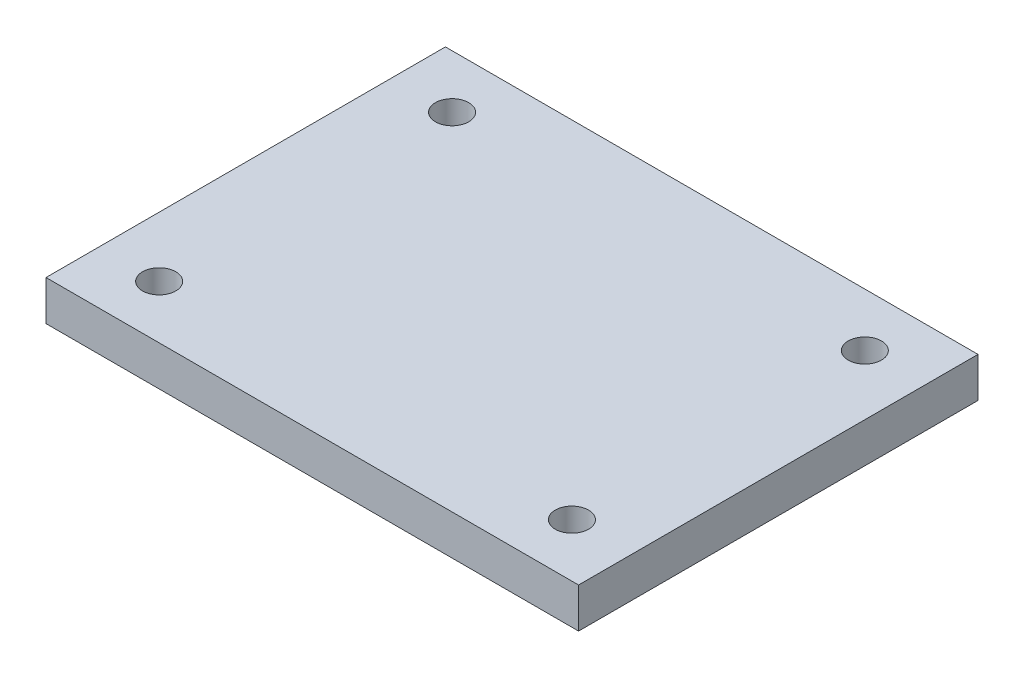
ISO-10303-21;
HEADER;
FILE_DESCRIPTION(('STEP AP214'),'2;1');
FILE_NAME('part.step','',(''),(''),'','','');
FILE_SCHEMA(('AUTOMOTIVE_DESIGN { 1 0 10303 214 1 1 1 1 }'));
ENDSEC;
DATA;
#1=APPLICATION_CONTEXT('core data for automotive mechanical design processes');
#2=APPLICATION_PROTOCOL_DEFINITION('international standard','automotive_design',2000,#1);
#3=PRODUCT_CONTEXT('',#1,'mechanical');
#4=PRODUCT('Part','Part','',(#3));
#5=PRODUCT_RELATED_PRODUCT_CATEGORY('part','',(#4));
#6=PRODUCT_DEFINITION_FORMATION('','',#4);
#7=PRODUCT_DEFINITION_CONTEXT('part definition',#1,'design');
#8=PRODUCT_DEFINITION('design','',#6,#7);
#9=PRODUCT_DEFINITION_SHAPE('','',#8);
#10=(LENGTH_UNIT() NAMED_UNIT(*) SI_UNIT(.MILLI.,.METRE.));
#11=(NAMED_UNIT(*) PLANE_ANGLE_UNIT() SI_UNIT($,.RADIAN.));
#12=(NAMED_UNIT(*) SI_UNIT($,.STERADIAN.) SOLID_ANGLE_UNIT());
#13=UNCERTAINTY_MEASURE_WITH_UNIT(LENGTH_MEASURE(1.E-05),#10,'distance_accuracy_value','');
#14=(GEOMETRIC_REPRESENTATION_CONTEXT(3) GLOBAL_UNCERTAINTY_ASSIGNED_CONTEXT((#13)) GLOBAL_UNIT_ASSIGNED_CONTEXT((#10,
#11,#12)) REPRESENTATION_CONTEXT('',''));
#15=CARTESIAN_POINT('',(0.,0.,0.));
#16=DIRECTION('',(0.,0.,1.));
#17=DIRECTION('',(1.,0.,0.));
#18=AXIS2_PLACEMENT_3D('',#15,#16,#17);
#19=CARTESIAN_POINT('',(20.,3.,-15.));
#20=DIRECTION('',(-1.,0.,0.));
#21=DIRECTION('',(0.,0.,1.));
#22=AXIS2_PLACEMENT_3D('',#19,#20,#21);
#23=PLANE('',#22);
#24=DIRECTION('',(0.,0.,-1.));
#25=VECTOR('',#24,1.);
#26=CARTESIAN_POINT('',(20.,0.,-15.));
#27=LINE('',#26,#25);
#28=CARTESIAN_POINT('',(20.,0.,15.));
#29=VERTEX_POINT('',#28);
#30=CARTESIAN_POINT('',(20.,0.,-15.));
#31=VERTEX_POINT('',#30);
#32=EDGE_CURVE('E110',#29,#31,#27,.T.);
#33=ORIENTED_EDGE('',*,*,#32,.T.);
#34=DIRECTION('',(0.,-1.,0.));
#35=VECTOR('',#34,1.);
#36=CARTESIAN_POINT('',(20.,3.,-15.));
#37=LINE('',#36,#35);
#38=CARTESIAN_POINT('',(20.,3.,-15.));
#39=VERTEX_POINT('',#38);
#40=EDGE_CURVE('E11',#39,#31,#37,.T.);
#41=ORIENTED_EDGE('',*,*,#40,.F.);
#42=DIRECTION('',(0.,0.,-1.));
#43=VECTOR('',#42,1.);
#44=CARTESIAN_POINT('',(20.,3.,-15.));
#45=LINE('',#44,#43);
#46=CARTESIAN_POINT('',(20.,3.,15.));
#47=VERTEX_POINT('',#46);
#48=EDGE_CURVE('E94',#47,#39,#45,.T.);
#49=ORIENTED_EDGE('',*,*,#48,.F.);
#50=DIRECTION('',(0.,-1.,0.));
#51=VECTOR('',#50,1.);
#52=CARTESIAN_POINT('',(20.,3.,15.));
#53=LINE('',#52,#51);
#54=EDGE_CURVE('E103',#47,#29,#53,.T.);
#55=ORIENTED_EDGE('',*,*,#54,.T.);
#56=EDGE_LOOP('',(#33,#41,#49,#55));
#57=FACE_BOUND('',#56,.T.);
#58=ADVANCED_FACE('F41',(#57),#23,.F.);
#59=CARTESIAN_POINT('',(-20.,3.,-15.));
#60=DIRECTION('',(0.,0.,1.));
#61=DIRECTION('',(1.,0.,0.));
#62=AXIS2_PLACEMENT_3D('',#59,#60,#61);
#63=PLANE('',#62);
#64=DIRECTION('',(-1.,0.,0.));
#65=VECTOR('',#64,1.);
#66=CARTESIAN_POINT('',(-20.,0.,-15.));
#67=LINE('',#66,#65);
#68=CARTESIAN_POINT('',(-20.,0.,-15.));
#69=VERTEX_POINT('',#68);
#70=EDGE_CURVE('E98',#31,#69,#67,.T.);
#71=ORIENTED_EDGE('',*,*,#70,.T.);
#72=DIRECTION('',(0.,-1.,0.));
#73=VECTOR('',#72,1.);
#74=CARTESIAN_POINT('',(-20.,3.,-15.));
#75=LINE('',#74,#73);
#76=CARTESIAN_POINT('',(-20.,3.,-15.));
#77=VERTEX_POINT('',#76);
#78=EDGE_CURVE('E49',#77,#69,#75,.T.);
#79=ORIENTED_EDGE('',*,*,#78,.F.);
#80=DIRECTION('',(-1.,0.,0.));
#81=VECTOR('',#80,1.);
#82=CARTESIAN_POINT('',(-20.,3.,-15.));
#83=LINE('',#82,#81);
#84=EDGE_CURVE('E90',#39,#77,#83,.T.);
#85=ORIENTED_EDGE('',*,*,#84,.F.);
#86=ORIENTED_EDGE('',*,*,#40,.T.);
#87=EDGE_LOOP('',(#71,#79,#85,#86));
#88=FACE_BOUND('',#87,.T.);
#89=ADVANCED_FACE('F100',(#88),#63,.F.);
#90=CARTESIAN_POINT('',(-20.,3.,-15.));
#91=DIRECTION('',(1.,0.,0.));
#92=DIRECTION('',(0.,0.,-1.));
#93=AXIS2_PLACEMENT_3D('',#90,#91,#92);
#94=PLANE('',#93);
#95=DIRECTION('',(0.,0.,1.));
#96=VECTOR('',#95,1.);
#97=CARTESIAN_POINT('',(-20.,0.,-15.));
#98=LINE('',#97,#96);
#99=CARTESIAN_POINT('',(-20.,0.,15.));
#100=VERTEX_POINT('',#99);
#101=EDGE_CURVE('E76',#69,#100,#98,.T.);
#102=ORIENTED_EDGE('',*,*,#101,.T.);
#103=DIRECTION('',(0.,-1.,0.));
#104=VECTOR('',#103,1.);
#105=CARTESIAN_POINT('',(-20.,3.,15.));
#106=LINE('',#105,#104);
#107=CARTESIAN_POINT('',(-20.,3.,15.));
#108=VERTEX_POINT('',#107);
#109=EDGE_CURVE('E97',#108,#100,#106,.T.);
#110=ORIENTED_EDGE('',*,*,#109,.F.);
#111=DIRECTION('',(0.,0.,1.));
#112=VECTOR('',#111,1.);
#113=CARTESIAN_POINT('',(-20.,3.,-15.));
#114=LINE('',#113,#112);
#115=EDGE_CURVE('E95',#77,#108,#114,.T.);
#116=ORIENTED_EDGE('',*,*,#115,.F.);
#117=ORIENTED_EDGE('',*,*,#78,.T.);
#118=EDGE_LOOP('',(#102,#110,#116,#117));
#119=FACE_BOUND('',#118,.T.);
#120=ADVANCED_FACE('F101',(#119),#94,.F.);
#121=CARTESIAN_POINT('',(-20.,3.,15.));
#122=DIRECTION('',(0.,0.,-1.));
#123=DIRECTION('',(-1.,0.,0.));
#124=AXIS2_PLACEMENT_3D('',#121,#122,#123);
#125=PLANE('',#124);
#126=DIRECTION('',(1.,0.,0.));
#127=VECTOR('',#126,1.);
#128=CARTESIAN_POINT('',(-20.,0.,15.));
#129=LINE('',#128,#127);
#130=EDGE_CURVE('E85',#100,#29,#129,.T.);
#131=ORIENTED_EDGE('',*,*,#130,.T.);
#132=ORIENTED_EDGE('',*,*,#54,.F.);
#133=DIRECTION('',(1.,0.,0.));
#134=VECTOR('',#133,1.);
#135=CARTESIAN_POINT('',(-20.,3.,15.));
#136=LINE('',#135,#134);
#137=EDGE_CURVE('E56',#108,#47,#136,.T.);
#138=ORIENTED_EDGE('',*,*,#137,.F.);
#139=ORIENTED_EDGE('',*,*,#109,.T.);
#140=EDGE_LOOP('',(#131,#132,#138,#139));
#141=FACE_BOUND('',#140,.T.);
#142=ADVANCED_FACE('F158',(#141),#125,.F.);
#143=CARTESIAN_POINT('',(0.,3.,0.));
#144=DIRECTION('',(0.,1.,0.));
#145=DIRECTION('',(0.,0.,1.));
#146=AXIS2_PLACEMENT_3D('',#143,#144,#145);
#147=PLANE('',#146);
#148=CARTESIAN_POINT('',(15.5,3.,11.));
#149=DIRECTION('',(0.,1.,0.));
#150=DIRECTION('',(0.,0.,1.));
#151=AXIS2_PLACEMENT_3D('',#148,#149,#150);
#152=CIRCLE('',#151,1.25);
#153=CARTESIAN_POINT('',(15.5,3.,12.25));
#154=VERTEX_POINT('',#153);
#155=EDGE_CURVE('E227',#154,#154,#152,.T.);
#156=ORIENTED_EDGE('',*,*,#155,.F.);
#157=EDGE_LOOP('',(#156));
#158=FACE_BOUND('',#157,.T.);
#159=CARTESIAN_POINT('',(-15.5,3.,11.));
#160=DIRECTION('',(0.,1.,0.));
#161=DIRECTION('',(0.,0.,1.));
#162=AXIS2_PLACEMENT_3D('',#159,#160,#161);
#163=CIRCLE('',#162,1.25);
#164=CARTESIAN_POINT('',(-15.5,3.,12.25));
#165=VERTEX_POINT('',#164);
#166=EDGE_CURVE('E225',#165,#165,#163,.T.);
#167=ORIENTED_EDGE('',*,*,#166,.F.);
#168=EDGE_LOOP('',(#167));
#169=FACE_BOUND('',#168,.T.);
#170=CARTESIAN_POINT('',(-15.5,3.,-11.));
#171=DIRECTION('',(0.,1.,0.));
#172=DIRECTION('',(0.,0.,1.));
#173=AXIS2_PLACEMENT_3D('',#170,#171,#172);
#174=CIRCLE('',#173,1.25);
#175=CARTESIAN_POINT('',(-15.5,3.,-9.75));
#176=VERTEX_POINT('',#175);
#177=EDGE_CURVE('E214',#176,#176,#174,.T.);
#178=ORIENTED_EDGE('',*,*,#177,.F.);
#179=EDGE_LOOP('',(#178));
#180=FACE_BOUND('',#179,.T.);
#181=CARTESIAN_POINT('',(15.5,3.,-11.));
#182=DIRECTION('',(0.,1.,0.));
#183=DIRECTION('',(0.,0.,1.));
#184=AXIS2_PLACEMENT_3D('',#181,#182,#183);
#185=CIRCLE('',#184,1.25);
#186=CARTESIAN_POINT('',(15.5,3.,-9.75));
#187=VERTEX_POINT('',#186);
#188=EDGE_CURVE('E118',#187,#187,#185,.T.);
#189=ORIENTED_EDGE('',*,*,#188,.F.);
#190=EDGE_LOOP('',(#189));
#191=FACE_BOUND('',#190,.T.);
#192=ORIENTED_EDGE('',*,*,#48,.T.);
#193=ORIENTED_EDGE('',*,*,#84,.T.);
#194=ORIENTED_EDGE('',*,*,#115,.T.);
#195=ORIENTED_EDGE('',*,*,#137,.T.);
#196=EDGE_LOOP('',(#192,#193,#194,#195));
#197=FACE_BOUND('',#196,.T.);
#198=ADVANCED_FACE('F89',(#158,#169,#180,#191,#197),#147,.T.);
#199=CARTESIAN_POINT('',(0.,0.,0.));
#200=DIRECTION('',(0.,1.,0.));
#201=DIRECTION('',(0.,0.,1.));
#202=AXIS2_PLACEMENT_3D('',#199,#200,#201);
#203=PLANE('',#202);
#204=CARTESIAN_POINT('',(15.5,0.,11.));
#205=DIRECTION('',(0.,1.,0.));
#206=DIRECTION('',(0.,0.,1.));
#207=AXIS2_PLACEMENT_3D('',#204,#205,#206);
#208=CIRCLE('',#207,1.25);
#209=CARTESIAN_POINT('',(15.5,0.,12.25));
#210=VERTEX_POINT('',#209);
#211=EDGE_CURVE('E42',#210,#210,#208,.T.);
#212=ORIENTED_EDGE('',*,*,#211,.T.);
#213=EDGE_LOOP('',(#212));
#214=FACE_BOUND('',#213,.T.);
#215=CARTESIAN_POINT('',(-15.5,0.,11.));
#216=DIRECTION('',(0.,1.,0.));
#217=DIRECTION('',(0.,0.,1.));
#218=AXIS2_PLACEMENT_3D('',#215,#216,#217);
#219=CIRCLE('',#218,1.25);
#220=CARTESIAN_POINT('',(-15.5,0.,12.25));
#221=VERTEX_POINT('',#220);
#222=EDGE_CURVE('E121',#221,#221,#219,.T.);
#223=ORIENTED_EDGE('',*,*,#222,.T.);
#224=EDGE_LOOP('',(#223));
#225=FACE_BOUND('',#224,.T.);
#226=CARTESIAN_POINT('',(-15.5,0.,-11.));
#227=DIRECTION('',(0.,1.,0.));
#228=DIRECTION('',(0.,0.,1.));
#229=AXIS2_PLACEMENT_3D('',#226,#227,#228);
#230=CIRCLE('',#229,1.25);
#231=CARTESIAN_POINT('',(-15.5,0.,-9.75));
#232=VERTEX_POINT('',#231);
#233=EDGE_CURVE('E119',#232,#232,#230,.T.);
#234=ORIENTED_EDGE('',*,*,#233,.T.);
#235=EDGE_LOOP('',(#234));
#236=FACE_BOUND('',#235,.T.);
#237=CARTESIAN_POINT('',(15.5,0.,-11.));
#238=DIRECTION('',(0.,1.,0.));
#239=DIRECTION('',(0.,0.,1.));
#240=AXIS2_PLACEMENT_3D('',#237,#238,#239);
#241=CIRCLE('',#240,1.25);
#242=CARTESIAN_POINT('',(15.5,0.,-9.75));
#243=VERTEX_POINT('',#242);
#244=EDGE_CURVE('E113',#243,#243,#241,.T.);
#245=ORIENTED_EDGE('',*,*,#244,.T.);
#246=EDGE_LOOP('',(#245));
#247=FACE_BOUND('',#246,.T.);
#248=ORIENTED_EDGE('',*,*,#32,.F.);
#249=ORIENTED_EDGE('',*,*,#130,.F.);
#250=ORIENTED_EDGE('',*,*,#101,.F.);
#251=ORIENTED_EDGE('',*,*,#70,.F.);
#252=EDGE_LOOP('',(#248,#249,#250,#251));
#253=FACE_BOUND('',#252,.T.);
#254=ADVANCED_FACE('F126',(#214,#225,#236,#247,#253),#203,.F.);
#255=CARTESIAN_POINT('',(15.5,-7.,-11.));
#256=DIRECTION('',(0.,1.,0.));
#257=DIRECTION('',(0.,0.,1.));
#258=AXIS2_PLACEMENT_3D('',#255,#256,#257);
#259=CYLINDRICAL_SURFACE('',#258,1.25);
#260=ORIENTED_EDGE('',*,*,#188,.T.);
#261=EDGE_LOOP('',(#260));
#262=FACE_BOUND('',#261,.T.);
#263=ORIENTED_EDGE('',*,*,#244,.F.);
#264=EDGE_LOOP('',(#263));
#265=FACE_BOUND('',#264,.T.);
#266=ADVANCED_FACE('F151',(#262,#265),#259,.F.);
#267=CARTESIAN_POINT('',(-15.5,-7.,-11.));
#268=DIRECTION('',(0.,1.,0.));
#269=DIRECTION('',(0.,0.,1.));
#270=AXIS2_PLACEMENT_3D('',#267,#268,#269);
#271=CYLINDRICAL_SURFACE('',#270,1.25);
#272=ORIENTED_EDGE('',*,*,#177,.T.);
#273=EDGE_LOOP('',(#272));
#274=FACE_BOUND('',#273,.T.);
#275=ORIENTED_EDGE('',*,*,#233,.F.);
#276=EDGE_LOOP('',(#275));
#277=FACE_BOUND('',#276,.T.);
#278=ADVANCED_FACE('F138',(#274,#277),#271,.F.);
#279=CARTESIAN_POINT('',(-15.5,-7.,11.));
#280=DIRECTION('',(0.,1.,0.));
#281=DIRECTION('',(0.,0.,1.));
#282=AXIS2_PLACEMENT_3D('',#279,#280,#281);
#283=CYLINDRICAL_SURFACE('',#282,1.25);
#284=ORIENTED_EDGE('',*,*,#166,.T.);
#285=EDGE_LOOP('',(#284));
#286=FACE_BOUND('',#285,.T.);
#287=ORIENTED_EDGE('',*,*,#222,.F.);
#288=EDGE_LOOP('',(#287));
#289=FACE_BOUND('',#288,.T.);
#290=ADVANCED_FACE('F132',(#286,#289),#283,.F.);
#291=CARTESIAN_POINT('',(15.5,-7.,11.));
#292=DIRECTION('',(0.,1.,0.));
#293=DIRECTION('',(0.,0.,1.));
#294=AXIS2_PLACEMENT_3D('',#291,#292,#293);
#295=CYLINDRICAL_SURFACE('',#294,1.25);
#296=ORIENTED_EDGE('',*,*,#155,.T.);
#297=EDGE_LOOP('',(#296));
#298=FACE_BOUND('',#297,.T.);
#299=ORIENTED_EDGE('',*,*,#211,.F.);
#300=EDGE_LOOP('',(#299));
#301=FACE_BOUND('',#300,.T.);
#302=ADVANCED_FACE('F128',(#298,#301),#295,.F.);
#303=CLOSED_SHELL('',(#58,#89,#120,#142,#198,#254,#266,#278,#290,#302));
#304=MANIFOLD_SOLID_BREP('B2',#303);
#305=ADVANCED_BREP_SHAPE_REPRESENTATION('',(#18,#304),#14);
#306=SHAPE_DEFINITION_REPRESENTATION(#9,#305);
ENDSEC;
END-ISO-10303-21;
